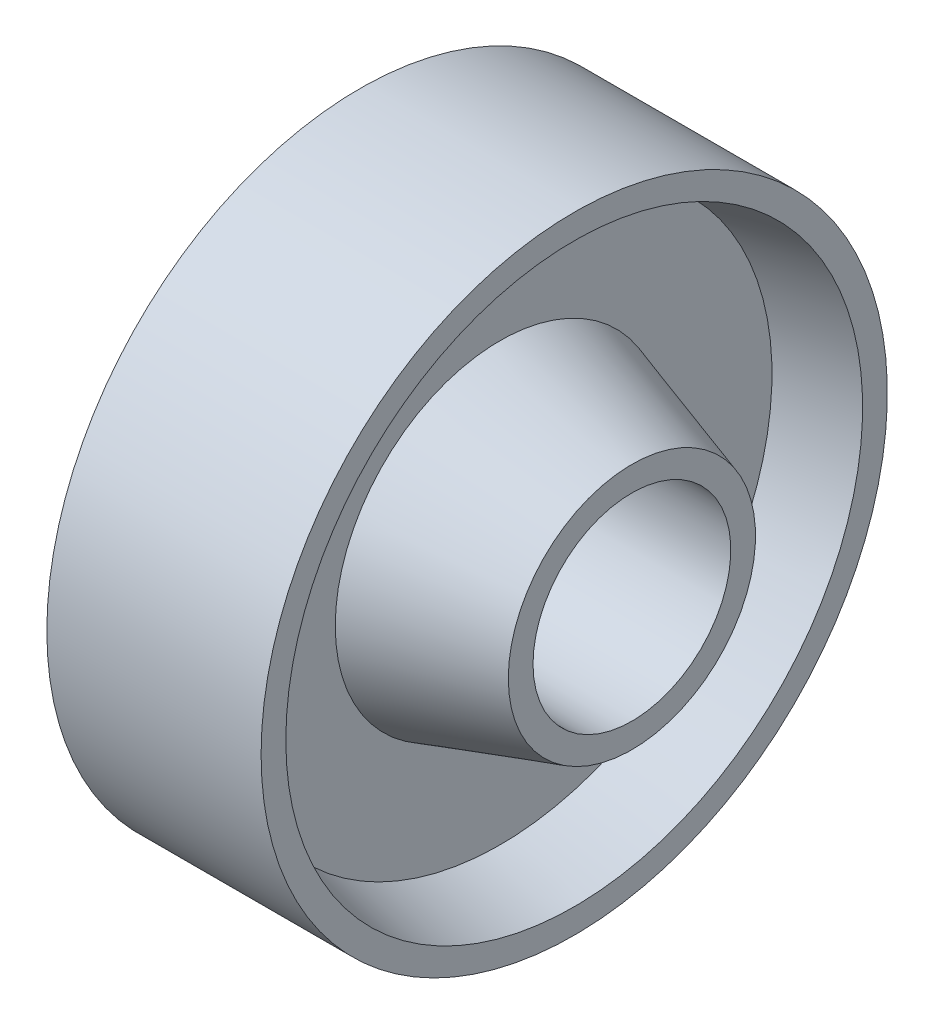
ISO-10303-21;
HEADER;
FILE_DESCRIPTION(('STEP AP214'),'2;1');
FILE_NAME('part.step','',(''),(''),'','','');
FILE_SCHEMA(('AUTOMOTIVE_DESIGN { 1 0 10303 214 1 1 1 1 }'));
ENDSEC;
DATA;
#1=APPLICATION_CONTEXT('core data for automotive mechanical design processes');
#2=APPLICATION_PROTOCOL_DEFINITION('international standard','automotive_design',2000,#1);
#3=PRODUCT_CONTEXT('',#1,'mechanical');
#4=PRODUCT('Part','Part','',(#3));
#5=PRODUCT_RELATED_PRODUCT_CATEGORY('part','',(#4));
#6=PRODUCT_DEFINITION_FORMATION('','',#4);
#7=PRODUCT_DEFINITION_CONTEXT('part definition',#1,'design');
#8=PRODUCT_DEFINITION('design','',#6,#7);
#9=PRODUCT_DEFINITION_SHAPE('','',#8);
#10=(LENGTH_UNIT() NAMED_UNIT(*) SI_UNIT(.MILLI.,.METRE.));
#11=(NAMED_UNIT(*) PLANE_ANGLE_UNIT() SI_UNIT($,.RADIAN.));
#12=(NAMED_UNIT(*) SI_UNIT($,.STERADIAN.) SOLID_ANGLE_UNIT());
#13=UNCERTAINTY_MEASURE_WITH_UNIT(LENGTH_MEASURE(1.E-05),#10,'distance_accuracy_value','');
#14=(GEOMETRIC_REPRESENTATION_CONTEXT(3) GLOBAL_UNCERTAINTY_ASSIGNED_CONTEXT((#13)) GLOBAL_UNIT_ASSIGNED_CONTEXT((#10,
#11,#12)) REPRESENTATION_CONTEXT('',''));
#15=CARTESIAN_POINT('',(0.,0.,0.));
#16=DIRECTION('',(0.,0.,1.));
#17=DIRECTION('',(1.,0.,0.));
#18=AXIS2_PLACEMENT_3D('',#15,#16,#17);
#19=CARTESIAN_POINT('',(40.,0.,0.));
#20=DIRECTION('',(-1.,0.,0.));
#21=DIRECTION('',(0.,0.,1.));
#22=AXIS2_PLACEMENT_3D('',#19,#20,#21);
#23=CONICAL_SURFACE('',#22,15.,0.302884868374971);
#24=CARTESIAN_POINT('',(24.,0.,0.));
#25=DIRECTION('',(-1.,0.,0.));
#26=DIRECTION('',(0.,0.,1.));
#27=AXIS2_PLACEMENT_3D('',#24,#25,#26);
#28=CIRCLE('',#27,20.);
#29=CARTESIAN_POINT('',(24.,0.,20.));
#30=VERTEX_POINT('',#29);
#31=EDGE_CURVE('E10',#30,#30,#28,.T.);
#32=ORIENTED_EDGE('',*,*,#31,.F.);
#33=EDGE_LOOP('',(#32));
#34=FACE_BOUND('',#33,.T.);
#35=CARTESIAN_POINT('',(40.,0.,0.));
#36=DIRECTION('',(-1.,0.,0.));
#37=DIRECTION('',(0.,0.,1.));
#38=AXIS2_PLACEMENT_3D('',#35,#36,#37);
#39=CIRCLE('',#38,15.);
#40=CARTESIAN_POINT('',(40.,0.,15.));
#41=VERTEX_POINT('',#40);
#42=EDGE_CURVE('E88',#41,#41,#39,.T.);
#43=ORIENTED_EDGE('',*,*,#42,.T.);
#44=EDGE_LOOP('',(#43));
#45=FACE_BOUND('',#44,.T.);
#46=ADVANCED_FACE('F37',(#34,#45),#23,.T.);
#47=CARTESIAN_POINT('',(24.,33.,0.));
#48=DIRECTION('',(-1.,0.,0.));
#49=DIRECTION('',(0.,0.,1.));
#50=AXIS2_PLACEMENT_3D('',#47,#48,#49);
#51=PLANE('',#50);
#52=CARTESIAN_POINT('',(24.,0.,0.));
#53=DIRECTION('',(-1.,0.,0.));
#54=DIRECTION('',(0.,0.,1.));
#55=AXIS2_PLACEMENT_3D('',#52,#53,#54);
#56=CIRCLE('',#55,33.);
#57=CARTESIAN_POINT('',(24.,0.,33.));
#58=VERTEX_POINT('',#57);
#59=EDGE_CURVE('E44',#58,#58,#56,.T.);
#60=ORIENTED_EDGE('',*,*,#59,.F.);
#61=EDGE_LOOP('',(#60));
#62=FACE_BOUND('',#61,.T.);
#63=ORIENTED_EDGE('',*,*,#31,.T.);
#64=EDGE_LOOP('',(#63));
#65=FACE_BOUND('',#64,.T.);
#66=ADVANCED_FACE('F150',(#62,#65),#51,.F.);
#67=CARTESIAN_POINT('',(24.,0.,0.));
#68=DIRECTION('',(1.,0.,0.));
#69=DIRECTION('',(0.,0.,-1.));
#70=AXIS2_PLACEMENT_3D('',#67,#68,#69);
#71=CONICAL_SURFACE('',#70,33.,0.218668945873942);
#72=CARTESIAN_POINT('',(33.,0.,0.));
#73=DIRECTION('',(-1.,0.,0.));
#74=DIRECTION('',(0.,0.,1.));
#75=AXIS2_PLACEMENT_3D('',#72,#73,#74);
#76=CIRCLE('',#75,35.);
#77=CARTESIAN_POINT('',(33.,0.,35.));
#78=VERTEX_POINT('',#77);
#79=EDGE_CURVE('E49',#78,#78,#76,.T.);
#80=ORIENTED_EDGE('',*,*,#79,.F.);
#81=EDGE_LOOP('',(#80));
#82=FACE_BOUND('',#81,.T.);
#83=ORIENTED_EDGE('',*,*,#59,.T.);
#84=EDGE_LOOP('',(#83));
#85=FACE_BOUND('',#84,.T.);
#86=ADVANCED_FACE('F145',(#82,#85),#71,.F.);
#87=CARTESIAN_POINT('',(33.,38.,0.));
#88=DIRECTION('',(-1.,0.,0.));
#89=DIRECTION('',(0.,0.,1.));
#90=AXIS2_PLACEMENT_3D('',#87,#88,#89);
#91=PLANE('',#90);
#92=CARTESIAN_POINT('',(33.,0.,0.));
#93=DIRECTION('',(-1.,0.,0.));
#94=DIRECTION('',(0.,0.,1.));
#95=AXIS2_PLACEMENT_3D('',#92,#93,#94);
#96=CIRCLE('',#95,38.);
#97=CARTESIAN_POINT('',(33.,0.,38.));
#98=VERTEX_POINT('',#97);
#99=EDGE_CURVE('E54',#98,#98,#96,.T.);
#100=ORIENTED_EDGE('',*,*,#99,.F.);
#101=EDGE_LOOP('',(#100));
#102=FACE_BOUND('',#101,.T.);
#103=ORIENTED_EDGE('',*,*,#79,.T.);
#104=EDGE_LOOP('',(#103));
#105=FACE_BOUND('',#104,.T.);
#106=ADVANCED_FACE('F139',(#102,#105),#91,.F.);
#107=CARTESIAN_POINT('',(0.,0.,0.));
#108=DIRECTION('',(-1.,0.,0.));
#109=DIRECTION('',(0.,0.,1.));
#110=AXIS2_PLACEMENT_3D('',#107,#108,#109);
#111=CYLINDRICAL_SURFACE('',#110,38.);
#112=CARTESIAN_POINT('',(7.,0.,0.));
#113=DIRECTION('',(-1.,0.,0.));
#114=DIRECTION('',(0.,0.,1.));
#115=AXIS2_PLACEMENT_3D('',#112,#113,#114);
#116=CIRCLE('',#115,38.);
#117=CARTESIAN_POINT('',(7.,0.,38.));
#118=VERTEX_POINT('',#117);
#119=EDGE_CURVE('E60',#118,#118,#116,.T.);
#120=ORIENTED_EDGE('',*,*,#119,.F.);
#121=EDGE_LOOP('',(#120));
#122=FACE_BOUND('',#121,.T.);
#123=ORIENTED_EDGE('',*,*,#99,.T.);
#124=EDGE_LOOP('',(#123));
#125=FACE_BOUND('',#124,.T.);
#126=ADVANCED_FACE('F133',(#122,#125),#111,.T.);
#127=CARTESIAN_POINT('',(7.,38.,0.));
#128=DIRECTION('',(1.,0.,0.));
#129=DIRECTION('',(0.,0.,-1.));
#130=AXIS2_PLACEMENT_3D('',#127,#128,#129);
#131=PLANE('',#130);
#132=CARTESIAN_POINT('',(7.,0.,0.));
#133=DIRECTION('',(-1.,0.,0.));
#134=DIRECTION('',(0.,0.,1.));
#135=AXIS2_PLACEMENT_3D('',#132,#133,#134);
#136=CIRCLE('',#135,35.);
#137=CARTESIAN_POINT('',(7.,0.,35.));
#138=VERTEX_POINT('',#137);
#139=EDGE_CURVE('E64',#138,#138,#136,.T.);
#140=ORIENTED_EDGE('',*,*,#139,.F.);
#141=EDGE_LOOP('',(#140));
#142=FACE_BOUND('',#141,.T.);
#143=ORIENTED_EDGE('',*,*,#119,.T.);
#144=EDGE_LOOP('',(#143));
#145=FACE_BOUND('',#144,.T.);
#146=ADVANCED_FACE('F127',(#142,#145),#131,.F.);
#147=CARTESIAN_POINT('',(7.,0.,0.));
#148=DIRECTION('',(-1.,0.,0.));
#149=DIRECTION('',(0.,0.,1.));
#150=AXIS2_PLACEMENT_3D('',#147,#148,#149);
#151=CONICAL_SURFACE('',#150,35.,0.218668945873942);
#152=CARTESIAN_POINT('',(16.,0.,0.));
#153=DIRECTION('',(-1.,0.,0.));
#154=DIRECTION('',(0.,0.,1.));
#155=AXIS2_PLACEMENT_3D('',#152,#153,#154);
#156=CIRCLE('',#155,33.);
#157=CARTESIAN_POINT('',(16.,0.,33.));
#158=VERTEX_POINT('',#157);
#159=EDGE_CURVE('E68',#158,#158,#156,.T.);
#160=ORIENTED_EDGE('',*,*,#159,.F.);
#161=EDGE_LOOP('',(#160));
#162=FACE_BOUND('',#161,.T.);
#163=ORIENTED_EDGE('',*,*,#139,.T.);
#164=EDGE_LOOP('',(#163));
#165=FACE_BOUND('',#164,.T.);
#166=ADVANCED_FACE('F121',(#162,#165),#151,.F.);
#167=CARTESIAN_POINT('',(16.,33.,0.));
#168=DIRECTION('',(1.,0.,0.));
#169=DIRECTION('',(0.,0.,-1.));
#170=AXIS2_PLACEMENT_3D('',#167,#168,#169);
#171=PLANE('',#170);
#172=CARTESIAN_POINT('',(16.,0.,0.));
#173=DIRECTION('',(-1.,0.,0.));
#174=DIRECTION('',(0.,0.,1.));
#175=AXIS2_PLACEMENT_3D('',#172,#173,#174);
#176=CIRCLE('',#175,20.);
#177=CARTESIAN_POINT('',(16.,0.,20.));
#178=VERTEX_POINT('',#177);
#179=EDGE_CURVE('E72',#178,#178,#176,.T.);
#180=ORIENTED_EDGE('',*,*,#179,.F.);
#181=EDGE_LOOP('',(#180));
#182=FACE_BOUND('',#181,.T.);
#183=ORIENTED_EDGE('',*,*,#159,.T.);
#184=EDGE_LOOP('',(#183));
#185=FACE_BOUND('',#184,.T.);
#186=ADVANCED_FACE('F115',(#182,#185),#171,.F.);
#187=CARTESIAN_POINT('',(16.,0.,0.));
#188=DIRECTION('',(1.,0.,0.));
#189=DIRECTION('',(0.,0.,-1.));
#190=AXIS2_PLACEMENT_3D('',#187,#188,#189);
#191=CONICAL_SURFACE('',#190,20.,0.302884868374971);
#192=CARTESIAN_POINT('',(0.,0.,0.));
#193=DIRECTION('',(-1.,0.,0.));
#194=DIRECTION('',(0.,0.,1.));
#195=AXIS2_PLACEMENT_3D('',#192,#193,#194);
#196=CIRCLE('',#195,15.);
#197=CARTESIAN_POINT('',(0.,0.,15.));
#198=VERTEX_POINT('',#197);
#199=EDGE_CURVE('E76',#198,#198,#196,.T.);
#200=ORIENTED_EDGE('',*,*,#199,.F.);
#201=EDGE_LOOP('',(#200));
#202=FACE_BOUND('',#201,.T.);
#203=ORIENTED_EDGE('',*,*,#179,.T.);
#204=EDGE_LOOP('',(#203));
#205=FACE_BOUND('',#204,.T.);
#206=ADVANCED_FACE('F109',(#202,#205),#191,.T.);
#207=CARTESIAN_POINT('',(0.,12.,0.));
#208=DIRECTION('',(1.,0.,0.));
#209=DIRECTION('',(0.,0.,-1.));
#210=AXIS2_PLACEMENT_3D('',#207,#208,#209);
#211=PLANE('',#210);
#212=CARTESIAN_POINT('',(0.,0.,0.));
#213=DIRECTION('',(-1.,0.,0.));
#214=DIRECTION('',(0.,0.,1.));
#215=AXIS2_PLACEMENT_3D('',#212,#213,#214);
#216=CIRCLE('',#215,12.);
#217=CARTESIAN_POINT('',(0.,0.,12.));
#218=VERTEX_POINT('',#217);
#219=EDGE_CURVE('E80',#218,#218,#216,.T.);
#220=ORIENTED_EDGE('',*,*,#219,.F.);
#221=EDGE_LOOP('',(#220));
#222=FACE_BOUND('',#221,.T.);
#223=ORIENTED_EDGE('',*,*,#199,.T.);
#224=EDGE_LOOP('',(#223));
#225=FACE_BOUND('',#224,.T.);
#226=ADVANCED_FACE('F103',(#222,#225),#211,.F.);
#227=CARTESIAN_POINT('',(0.,0.,0.));
#228=DIRECTION('',(-1.,0.,0.));
#229=DIRECTION('',(0.,0.,1.));
#230=AXIS2_PLACEMENT_3D('',#227,#228,#229);
#231=CYLINDRICAL_SURFACE('',#230,12.);
#232=CARTESIAN_POINT('',(40.,0.,0.));
#233=DIRECTION('',(-1.,0.,0.));
#234=DIRECTION('',(0.,0.,1.));
#235=AXIS2_PLACEMENT_3D('',#232,#233,#234);
#236=CIRCLE('',#235,12.);
#237=CARTESIAN_POINT('',(40.,0.,12.));
#238=VERTEX_POINT('',#237);
#239=EDGE_CURVE('E84',#238,#238,#236,.T.);
#240=ORIENTED_EDGE('',*,*,#239,.F.);
#241=EDGE_LOOP('',(#240));
#242=FACE_BOUND('',#241,.T.);
#243=ORIENTED_EDGE('',*,*,#219,.T.);
#244=EDGE_LOOP('',(#243));
#245=FACE_BOUND('',#244,.T.);
#246=ADVANCED_FACE('F97',(#242,#245),#231,.F.);
#247=CARTESIAN_POINT('',(40.,12.,0.));
#248=DIRECTION('',(-1.,0.,0.));
#249=DIRECTION('',(0.,0.,1.));
#250=AXIS2_PLACEMENT_3D('',#247,#248,#249);
#251=PLANE('',#250);
#252=ORIENTED_EDGE('',*,*,#42,.F.);
#253=EDGE_LOOP('',(#252));
#254=FACE_BOUND('',#253,.T.);
#255=ORIENTED_EDGE('',*,*,#239,.T.);
#256=EDGE_LOOP('',(#255));
#257=FACE_BOUND('',#256,.T.);
#258=ADVANCED_FACE('F94',(#254,#257),#251,.F.);
#259=CLOSED_SHELL('',(#46,#66,#86,#106,#126,#146,#166,#186,#206,#226,#246,#258));
#260=MANIFOLD_SOLID_BREP('B2',#259);
#261=ADVANCED_BREP_SHAPE_REPRESENTATION('',(#18,#260),#14);
#262=SHAPE_DEFINITION_REPRESENTATION(#9,#261);
ENDSEC;
END-ISO-10303-21;
